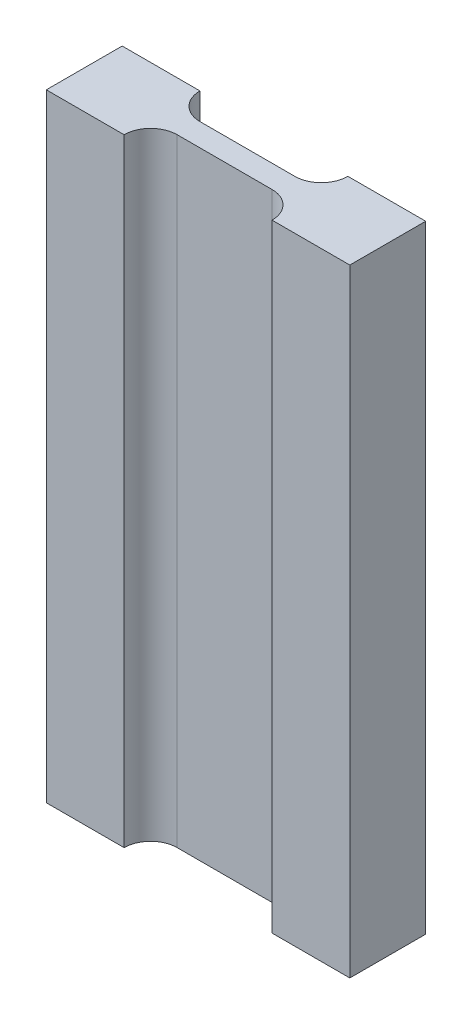
ISO-10303-21;
HEADER;
FILE_DESCRIPTION(('STEP AP214'),'2;1');
FILE_NAME('part.step','',(''),(''),'','','');
FILE_SCHEMA(('AUTOMOTIVE_DESIGN { 1 0 10303 214 1 1 1 1 }'));
ENDSEC;
DATA;
#1=APPLICATION_CONTEXT('core data for automotive mechanical design processes');
#2=APPLICATION_PROTOCOL_DEFINITION('international standard','automotive_design',2000,#1);
#3=PRODUCT_CONTEXT('',#1,'mechanical');
#4=PRODUCT('Part','Part','',(#3));
#5=PRODUCT_RELATED_PRODUCT_CATEGORY('part','',(#4));
#6=PRODUCT_DEFINITION_FORMATION('','',#4);
#7=PRODUCT_DEFINITION_CONTEXT('part definition',#1,'design');
#8=PRODUCT_DEFINITION('design','',#6,#7);
#9=PRODUCT_DEFINITION_SHAPE('','',#8);
#10=(LENGTH_UNIT() NAMED_UNIT(*) SI_UNIT(.MILLI.,.METRE.));
#11=(NAMED_UNIT(*) PLANE_ANGLE_UNIT() SI_UNIT($,.RADIAN.));
#12=(NAMED_UNIT(*) SI_UNIT($,.STERADIAN.) SOLID_ANGLE_UNIT());
#13=UNCERTAINTY_MEASURE_WITH_UNIT(LENGTH_MEASURE(1.E-05),#10,'distance_accuracy_value','');
#14=(GEOMETRIC_REPRESENTATION_CONTEXT(3) GLOBAL_UNCERTAINTY_ASSIGNED_CONTEXT((#13)) GLOBAL_UNIT_ASSIGNED_CONTEXT((#10,
#11,#12)) REPRESENTATION_CONTEXT('',''));
#15=CARTESIAN_POINT('',(0.,0.,0.));
#16=DIRECTION('',(0.,0.,1.));
#17=DIRECTION('',(1.,0.,0.));
#18=AXIS2_PLACEMENT_3D('',#15,#16,#17);
#19=CARTESIAN_POINT('',(0.,32.55,0.));
#20=DIRECTION('',(1.,0.,0.));
#21=DIRECTION('',(0.,0.,-1.));
#22=AXIS2_PLACEMENT_3D('',#19,#20,#21);
#23=PLANE('',#22);
#24=DIRECTION('',(0.,0.,1.));
#25=VECTOR('',#24,1.);
#26=CARTESIAN_POINT('',(0.,0.,0.));
#27=LINE('',#26,#25);
#28=CARTESIAN_POINT('',(0.,0.,-4.));
#29=VERTEX_POINT('',#28);
#30=CARTESIAN_POINT('',(0.,0.,0.));
#31=VERTEX_POINT('',#30);
#32=EDGE_CURVE('E169',#29,#31,#27,.T.);
#33=ORIENTED_EDGE('',*,*,#32,.T.);
#34=DIRECTION('',(0.,-1.,0.));
#35=VECTOR('',#34,1.);
#36=CARTESIAN_POINT('',(0.,32.55,0.));
#37=LINE('',#36,#35);
#38=CARTESIAN_POINT('',(0.,32.55,0.));
#39=VERTEX_POINT('',#38);
#40=EDGE_CURVE('E11',#39,#31,#37,.T.);
#41=ORIENTED_EDGE('',*,*,#40,.F.);
#42=DIRECTION('',(0.,0.,1.));
#43=VECTOR('',#42,1.);
#44=CARTESIAN_POINT('',(0.,32.55,0.));
#45=LINE('',#44,#43);
#46=CARTESIAN_POINT('',(0.,32.55,-4.));
#47=VERTEX_POINT('',#46);
#48=EDGE_CURVE('E204',#47,#39,#45,.T.);
#49=ORIENTED_EDGE('',*,*,#48,.F.);
#50=DIRECTION('',(0.,-1.,0.));
#51=VECTOR('',#50,1.);
#52=CARTESIAN_POINT('',(0.,32.55,-4.));
#53=LINE('',#52,#51);
#54=EDGE_CURVE('E168',#47,#29,#53,.T.);
#55=ORIENTED_EDGE('',*,*,#54,.T.);
#56=EDGE_LOOP('',(#33,#41,#49,#55));
#57=FACE_BOUND('',#56,.T.);
#58=ADVANCED_FACE('F44',(#57),#23,.F.);
#59=CARTESIAN_POINT('',(0.,32.55,0.));
#60=DIRECTION('',(0.,0.,-1.));
#61=DIRECTION('',(-1.,0.,0.));
#62=AXIS2_PLACEMENT_3D('',#59,#60,#61);
#63=PLANE('',#62);
#64=DIRECTION('',(1.,0.,0.));
#65=VECTOR('',#64,1.);
#66=CARTESIAN_POINT('',(0.,0.,0.));
#67=LINE('',#66,#65);
#68=CARTESIAN_POINT('',(4.1,0.,0.));
#69=VERTEX_POINT('',#68);
#70=EDGE_CURVE('E174',#31,#69,#67,.T.);
#71=ORIENTED_EDGE('',*,*,#70,.T.);
#72=DIRECTION('',(0.,-1.,0.));
#73=VECTOR('',#72,1.);
#74=CARTESIAN_POINT('',(4.1,32.55,0.));
#75=LINE('',#74,#73);
#76=CARTESIAN_POINT('',(4.1,32.55,0.));
#77=VERTEX_POINT('',#76);
#78=EDGE_CURVE('E53',#77,#69,#75,.T.);
#79=ORIENTED_EDGE('',*,*,#78,.F.);
#80=DIRECTION('',(1.,0.,0.));
#81=VECTOR('',#80,1.);
#82=CARTESIAN_POINT('',(0.,32.55,0.));
#83=LINE('',#82,#81);
#84=EDGE_CURVE('E117',#39,#77,#83,.T.);
#85=ORIENTED_EDGE('',*,*,#84,.F.);
#86=ORIENTED_EDGE('',*,*,#40,.T.);
#87=EDGE_LOOP('',(#71,#79,#85,#86));
#88=FACE_BOUND('',#87,.T.);
#89=ADVANCED_FACE('F299',(#88),#63,.F.);
#90=CARTESIAN_POINT('',(5.5,32.55,0.));
#91=DIRECTION('',(0.,-1.,0.));
#92=DIRECTION('',(0.,0.,-1.));
#93=AXIS2_PLACEMENT_3D('',#90,#91,#92);
#94=CYLINDRICAL_SURFACE('',#93,1.4);
#95=CARTESIAN_POINT('',(5.5,0.,0.));
#96=DIRECTION('',(0.,-1.,0.));
#97=DIRECTION('',(0.,0.,1.));
#98=AXIS2_PLACEMENT_3D('',#95,#96,#97);
#99=CIRCLE('',#98,1.4);
#100=CARTESIAN_POINT('',(5.5,0.,-1.4));
#101=VERTEX_POINT('',#100);
#102=EDGE_CURVE('E180',#69,#101,#99,.T.);
#103=ORIENTED_EDGE('',*,*,#102,.T.);
#104=DIRECTION('',(0.,-1.,0.));
#105=VECTOR('',#104,1.);
#106=CARTESIAN_POINT('',(5.5,32.55,-1.4));
#107=LINE('',#106,#105);
#108=CARTESIAN_POINT('',(5.5,32.55,-1.4));
#109=VERTEX_POINT('',#108);
#110=EDGE_CURVE('E231',#109,#101,#107,.T.);
#111=ORIENTED_EDGE('',*,*,#110,.F.);
#112=CARTESIAN_POINT('',(5.5,32.55,0.));
#113=DIRECTION('',(0.,-1.,0.));
#114=DIRECTION('',(0.,0.,1.));
#115=AXIS2_PLACEMENT_3D('',#112,#113,#114);
#116=CIRCLE('',#115,1.4);
#117=EDGE_CURVE('E241',#77,#109,#116,.T.);
#118=ORIENTED_EDGE('',*,*,#117,.F.);
#119=ORIENTED_EDGE('',*,*,#78,.T.);
#120=EDGE_LOOP('',(#103,#111,#118,#119));
#121=FACE_BOUND('',#120,.T.);
#122=ADVANCED_FACE('F236',(#121),#94,.F.);
#123=CARTESIAN_POINT('',(5.5,32.55,-1.4));
#124=DIRECTION('',(0.,0.,-1.));
#125=DIRECTION('',(-1.,0.,0.));
#126=AXIS2_PLACEMENT_3D('',#123,#124,#125);
#127=PLANE('',#126);
#128=DIRECTION('',(1.,0.,0.));
#129=VECTOR('',#128,1.);
#130=CARTESIAN_POINT('',(5.5,0.,-1.4));
#131=LINE('',#130,#129);
#132=CARTESIAN_POINT('',(10.5,0.,-1.4));
#133=VERTEX_POINT('',#132);
#134=EDGE_CURVE('E179',#101,#133,#131,.T.);
#135=ORIENTED_EDGE('',*,*,#134,.T.);
#136=DIRECTION('',(0.,-1.,0.));
#137=VECTOR('',#136,1.);
#138=CARTESIAN_POINT('',(10.5,32.55,-1.4));
#139=LINE('',#138,#137);
#140=CARTESIAN_POINT('',(10.5,32.55,-1.4));
#141=VERTEX_POINT('',#140);
#142=EDGE_CURVE('E230',#141,#133,#139,.T.);
#143=ORIENTED_EDGE('',*,*,#142,.F.);
#144=DIRECTION('',(1.,0.,0.));
#145=VECTOR('',#144,1.);
#146=CARTESIAN_POINT('',(5.5,32.55,-1.4));
#147=LINE('',#146,#145);
#148=EDGE_CURVE('E259',#109,#141,#147,.T.);
#149=ORIENTED_EDGE('',*,*,#148,.F.);
#150=ORIENTED_EDGE('',*,*,#110,.T.);
#151=EDGE_LOOP('',(#135,#143,#149,#150));
#152=FACE_BOUND('',#151,.T.);
#153=ADVANCED_FACE('F248',(#152),#127,.F.);
#154=CARTESIAN_POINT('',(10.5,32.55,0.));
#155=DIRECTION('',(0.,-1.,0.));
#156=DIRECTION('',(0.,0.,-1.));
#157=AXIS2_PLACEMENT_3D('',#154,#155,#156);
#158=CYLINDRICAL_SURFACE('',#157,1.4);
#159=CARTESIAN_POINT('',(10.5,0.,0.));
#160=DIRECTION('',(0.,-1.,0.));
#161=DIRECTION('',(0.,0.,-1.));
#162=AXIS2_PLACEMENT_3D('',#159,#160,#161);
#163=CIRCLE('',#162,1.4);
#164=CARTESIAN_POINT('',(11.9,0.,0.));
#165=VERTEX_POINT('',#164);
#166=EDGE_CURVE('E183',#133,#165,#163,.T.);
#167=ORIENTED_EDGE('',*,*,#166,.T.);
#168=DIRECTION('',(0.,-1.,0.));
#169=VECTOR('',#168,1.);
#170=CARTESIAN_POINT('',(11.9,32.55,0.));
#171=LINE('',#170,#169);
#172=CARTESIAN_POINT('',(11.9,32.55,0.));
#173=VERTEX_POINT('',#172);
#174=EDGE_CURVE('E223',#173,#165,#171,.T.);
#175=ORIENTED_EDGE('',*,*,#174,.F.);
#176=CARTESIAN_POINT('',(10.5,32.55,0.));
#177=DIRECTION('',(0.,-1.,0.));
#178=DIRECTION('',(0.,0.,-1.));
#179=AXIS2_PLACEMENT_3D('',#176,#177,#178);
#180=CIRCLE('',#179,1.4);
#181=EDGE_CURVE('E258',#141,#173,#180,.T.);
#182=ORIENTED_EDGE('',*,*,#181,.F.);
#183=ORIENTED_EDGE('',*,*,#142,.T.);
#184=EDGE_LOOP('',(#167,#175,#182,#183));
#185=FACE_BOUND('',#184,.T.);
#186=ADVANCED_FACE('F253',(#185),#158,.F.);
#187=CARTESIAN_POINT('',(11.9,32.55,0.));
#188=DIRECTION('',(0.,0.,-1.));
#189=DIRECTION('',(-1.,0.,0.));
#190=AXIS2_PLACEMENT_3D('',#187,#188,#189);
#191=PLANE('',#190);
#192=DIRECTION('',(1.,0.,0.));
#193=VECTOR('',#192,1.);
#194=CARTESIAN_POINT('',(11.9,0.,0.));
#195=LINE('',#194,#193);
#196=CARTESIAN_POINT('',(16.,0.,0.));
#197=VERTEX_POINT('',#196);
#198=EDGE_CURVE('E186',#165,#197,#195,.T.);
#199=ORIENTED_EDGE('',*,*,#198,.T.);
#200=DIRECTION('',(0.,-1.,0.));
#201=VECTOR('',#200,1.);
#202=CARTESIAN_POINT('',(16.,32.55,0.));
#203=LINE('',#202,#201);
#204=CARTESIAN_POINT('',(16.,32.55,0.));
#205=VERTEX_POINT('',#204);
#206=EDGE_CURVE('E219',#205,#197,#203,.T.);
#207=ORIENTED_EDGE('',*,*,#206,.F.);
#208=DIRECTION('',(1.,0.,0.));
#209=VECTOR('',#208,1.);
#210=CARTESIAN_POINT('',(11.9,32.55,0.));
#211=LINE('',#210,#209);
#212=EDGE_CURVE('E260',#173,#205,#211,.T.);
#213=ORIENTED_EDGE('',*,*,#212,.F.);
#214=ORIENTED_EDGE('',*,*,#174,.T.);
#215=EDGE_LOOP('',(#199,#207,#213,#214));
#216=FACE_BOUND('',#215,.T.);
#217=ADVANCED_FACE('F311',(#216),#191,.F.);
#218=CARTESIAN_POINT('',(16.,32.55,0.));
#219=DIRECTION('',(-1.,0.,0.));
#220=DIRECTION('',(0.,0.,1.));
#221=AXIS2_PLACEMENT_3D('',#218,#219,#220);
#222=PLANE('',#221);
#223=DIRECTION('',(0.,0.,-1.));
#224=VECTOR('',#223,1.);
#225=CARTESIAN_POINT('',(16.,0.,0.));
#226=LINE('',#225,#224);
#227=CARTESIAN_POINT('',(16.,0.,-4.));
#228=VERTEX_POINT('',#227);
#229=EDGE_CURVE('E188',#197,#228,#226,.T.);
#230=ORIENTED_EDGE('',*,*,#229,.T.);
#231=DIRECTION('',(0.,-1.,0.));
#232=VECTOR('',#231,1.);
#233=CARTESIAN_POINT('',(16.,32.55,-4.));
#234=LINE('',#233,#232);
#235=CARTESIAN_POINT('',(16.,32.55,-4.));
#236=VERTEX_POINT('',#235);
#237=EDGE_CURVE('E214',#236,#228,#234,.T.);
#238=ORIENTED_EDGE('',*,*,#237,.F.);
#239=DIRECTION('',(0.,0.,-1.));
#240=VECTOR('',#239,1.);
#241=CARTESIAN_POINT('',(16.,32.55,0.));
#242=LINE('',#241,#240);
#243=EDGE_CURVE('E264',#205,#236,#242,.T.);
#244=ORIENTED_EDGE('',*,*,#243,.F.);
#245=ORIENTED_EDGE('',*,*,#206,.T.);
#246=EDGE_LOOP('',(#230,#238,#244,#245));
#247=FACE_BOUND('',#246,.T.);
#248=ADVANCED_FACE('F312',(#247),#222,.F.);
#249=CARTESIAN_POINT('',(11.9,32.55,-4.));
#250=DIRECTION('',(0.,0.,1.));
#251=DIRECTION('',(1.,0.,0.));
#252=AXIS2_PLACEMENT_3D('',#249,#250,#251);
#253=PLANE('',#252);
#254=DIRECTION('',(-1.,0.,0.));
#255=VECTOR('',#254,1.);
#256=CARTESIAN_POINT('',(11.9,0.,-4.));
#257=LINE('',#256,#255);
#258=CARTESIAN_POINT('',(11.9,0.,-4.));
#259=VERTEX_POINT('',#258);
#260=EDGE_CURVE('E195',#228,#259,#257,.T.);
#261=ORIENTED_EDGE('',*,*,#260,.T.);
#262=DIRECTION('',(0.,-1.,0.));
#263=VECTOR('',#262,1.);
#264=CARTESIAN_POINT('',(11.9,32.55,-4.));
#265=LINE('',#264,#263);
#266=CARTESIAN_POINT('',(11.9,32.55,-4.));
#267=VERTEX_POINT('',#266);
#268=EDGE_CURVE('E213',#267,#259,#265,.T.);
#269=ORIENTED_EDGE('',*,*,#268,.F.);
#270=DIRECTION('',(-1.,0.,0.));
#271=VECTOR('',#270,1.);
#272=CARTESIAN_POINT('',(11.9,32.55,-4.));
#273=LINE('',#272,#271);
#274=EDGE_CURVE('E271',#236,#267,#273,.T.);
#275=ORIENTED_EDGE('',*,*,#274,.F.);
#276=ORIENTED_EDGE('',*,*,#237,.T.);
#277=EDGE_LOOP('',(#261,#269,#275,#276));
#278=FACE_BOUND('',#277,.T.);
#279=ADVANCED_FACE('F278',(#278),#253,.F.);
#280=CARTESIAN_POINT('',(10.5,32.55,-4.));
#281=DIRECTION('',(0.,-1.,0.));
#282=DIRECTION('',(0.,0.,-1.));
#283=AXIS2_PLACEMENT_3D('',#280,#281,#282);
#284=CYLINDRICAL_SURFACE('',#283,1.4);
#285=CARTESIAN_POINT('',(10.5,0.,-4.));
#286=DIRECTION('',(0.,-1.,0.));
#287=DIRECTION('',(0.,0.,1.));
#288=AXIS2_PLACEMENT_3D('',#285,#286,#287);
#289=CIRCLE('',#288,1.4);
#290=CARTESIAN_POINT('',(10.5,0.,-2.6));
#291=VERTEX_POINT('',#290);
#292=EDGE_CURVE('E193',#259,#291,#289,.T.);
#293=ORIENTED_EDGE('',*,*,#292,.T.);
#294=DIRECTION('',(0.,-1.,0.));
#295=VECTOR('',#294,1.);
#296=CARTESIAN_POINT('',(10.5,32.55,-2.6));
#297=LINE('',#296,#295);
#298=CARTESIAN_POINT('',(10.5,32.55,-2.6));
#299=VERTEX_POINT('',#298);
#300=EDGE_CURVE('E159',#299,#291,#297,.T.);
#301=ORIENTED_EDGE('',*,*,#300,.F.);
#302=CARTESIAN_POINT('',(10.5,32.55,-4.));
#303=DIRECTION('',(0.,-1.,0.));
#304=DIRECTION('',(0.,0.,1.));
#305=AXIS2_PLACEMENT_3D('',#302,#303,#304);
#306=CIRCLE('',#305,1.4);
#307=EDGE_CURVE('E149',#267,#299,#306,.T.);
#308=ORIENTED_EDGE('',*,*,#307,.F.);
#309=ORIENTED_EDGE('',*,*,#268,.T.);
#310=EDGE_LOOP('',(#293,#301,#308,#309));
#311=FACE_BOUND('',#310,.T.);
#312=ADVANCED_FACE('F284',(#311),#284,.F.);
#313=CARTESIAN_POINT('',(5.5,32.55,-2.6));
#314=DIRECTION('',(0.,0.,1.));
#315=DIRECTION('',(1.,0.,0.));
#316=AXIS2_PLACEMENT_3D('',#313,#314,#315);
#317=PLANE('',#316);
#318=DIRECTION('',(-1.,0.,0.));
#319=VECTOR('',#318,1.);
#320=CARTESIAN_POINT('',(5.5,0.,-2.6));
#321=LINE('',#320,#319);
#322=CARTESIAN_POINT('',(5.5,0.,-2.6));
#323=VERTEX_POINT('',#322);
#324=EDGE_CURVE('E160',#291,#323,#321,.T.);
#325=ORIENTED_EDGE('',*,*,#324,.T.);
#326=DIRECTION('',(0.,-1.,0.));
#327=VECTOR('',#326,1.);
#328=CARTESIAN_POINT('',(5.5,32.55,-2.6));
#329=LINE('',#328,#327);
#330=CARTESIAN_POINT('',(5.5,32.55,-2.6));
#331=VERTEX_POINT('',#330);
#332=EDGE_CURVE('E153',#331,#323,#329,.T.);
#333=ORIENTED_EDGE('',*,*,#332,.F.);
#334=DIRECTION('',(-1.,0.,0.));
#335=VECTOR('',#334,1.);
#336=CARTESIAN_POINT('',(5.5,32.55,-2.6));
#337=LINE('',#336,#335);
#338=EDGE_CURVE('E145',#299,#331,#337,.T.);
#339=ORIENTED_EDGE('',*,*,#338,.F.);
#340=ORIENTED_EDGE('',*,*,#300,.T.);
#341=EDGE_LOOP('',(#325,#333,#339,#340));
#342=FACE_BOUND('',#341,.T.);
#343=ADVANCED_FACE('F155',(#342),#317,.F.);
#344=CARTESIAN_POINT('',(5.5,32.55,-4.));
#345=DIRECTION('',(0.,-1.,0.));
#346=DIRECTION('',(0.,0.,-1.));
#347=AXIS2_PLACEMENT_3D('',#344,#345,#346);
#348=CYLINDRICAL_SURFACE('',#347,1.4);
#349=CARTESIAN_POINT('',(5.5,0.,-4.));
#350=DIRECTION('',(0.,-1.,0.));
#351=DIRECTION('',(0.,0.,-1.));
#352=AXIS2_PLACEMENT_3D('',#349,#350,#351);
#353=CIRCLE('',#352,1.4);
#354=CARTESIAN_POINT('',(4.1,0.,-4.));
#355=VERTEX_POINT('',#354);
#356=EDGE_CURVE('E104',#323,#355,#353,.T.);
#357=ORIENTED_EDGE('',*,*,#356,.T.);
#358=DIRECTION('',(0.,-1.,0.));
#359=VECTOR('',#358,1.);
#360=CARTESIAN_POINT('',(4.1,32.55,-4.));
#361=LINE('',#360,#359);
#362=CARTESIAN_POINT('',(4.1,32.55,-4.));
#363=VERTEX_POINT('',#362);
#364=EDGE_CURVE('E158',#363,#355,#361,.T.);
#365=ORIENTED_EDGE('',*,*,#364,.F.);
#366=CARTESIAN_POINT('',(5.5,32.55,-4.));
#367=DIRECTION('',(0.,-1.,0.));
#368=DIRECTION('',(0.,0.,-1.));
#369=AXIS2_PLACEMENT_3D('',#366,#367,#368);
#370=CIRCLE('',#369,1.4);
#371=EDGE_CURVE('E147',#331,#363,#370,.T.);
#372=ORIENTED_EDGE('',*,*,#371,.F.);
#373=ORIENTED_EDGE('',*,*,#332,.T.);
#374=EDGE_LOOP('',(#357,#365,#372,#373));
#375=FACE_BOUND('',#374,.T.);
#376=ADVANCED_FACE('F162',(#375),#348,.F.);
#377=CARTESIAN_POINT('',(0.,32.55,-4.));
#378=DIRECTION('',(0.,0.,1.));
#379=DIRECTION('',(1.,0.,0.));
#380=AXIS2_PLACEMENT_3D('',#377,#378,#379);
#381=PLANE('',#380);
#382=DIRECTION('',(-1.,0.,0.));
#383=VECTOR('',#382,1.);
#384=CARTESIAN_POINT('',(0.,0.,-4.));
#385=LINE('',#384,#383);
#386=EDGE_CURVE('E108',#355,#29,#385,.T.);
#387=ORIENTED_EDGE('',*,*,#386,.T.);
#388=ORIENTED_EDGE('',*,*,#54,.F.);
#389=DIRECTION('',(-1.,0.,0.));
#390=VECTOR('',#389,1.);
#391=CARTESIAN_POINT('',(0.,32.55,-4.));
#392=LINE('',#391,#390);
#393=EDGE_CURVE('E62',#363,#47,#392,.T.);
#394=ORIENTED_EDGE('',*,*,#393,.F.);
#395=ORIENTED_EDGE('',*,*,#364,.T.);
#396=EDGE_LOOP('',(#387,#388,#394,#395));
#397=FACE_BOUND('',#396,.T.);
#398=ADVANCED_FACE('F287',(#397),#381,.F.);
#399=CARTESIAN_POINT('',(5.5,32.55,-4.));
#400=DIRECTION('',(0.,-1.,0.));
#401=DIRECTION('',(0.,0.,-1.));
#402=AXIS2_PLACEMENT_3D('',#399,#400,#401);
#403=PLANE('',#402);
#404=ORIENTED_EDGE('',*,*,#48,.T.);
#405=ORIENTED_EDGE('',*,*,#84,.T.);
#406=ORIENTED_EDGE('',*,*,#117,.T.);
#407=ORIENTED_EDGE('',*,*,#148,.T.);
#408=ORIENTED_EDGE('',*,*,#181,.T.);
#409=ORIENTED_EDGE('',*,*,#212,.T.);
#410=ORIENTED_EDGE('',*,*,#243,.T.);
#411=ORIENTED_EDGE('',*,*,#274,.T.);
#412=ORIENTED_EDGE('',*,*,#307,.T.);
#413=ORIENTED_EDGE('',*,*,#338,.T.);
#414=ORIENTED_EDGE('',*,*,#371,.T.);
#415=ORIENTED_EDGE('',*,*,#393,.T.);
#416=EDGE_LOOP('',(#404,#405,#406,#407,#408,#409,#410,#411,#412,#413,#414,#415));
#417=FACE_BOUND('',#416,.T.);
#418=ADVANCED_FACE('F143',(#417),#403,.F.);
#419=CARTESIAN_POINT('',(5.5,0.,-4.));
#420=DIRECTION('',(0.,-1.,0.));
#421=DIRECTION('',(0.,0.,-1.));
#422=AXIS2_PLACEMENT_3D('',#419,#420,#421);
#423=PLANE('',#422);
#424=ORIENTED_EDGE('',*,*,#32,.F.);
#425=ORIENTED_EDGE('',*,*,#386,.F.);
#426=ORIENTED_EDGE('',*,*,#356,.F.);
#427=ORIENTED_EDGE('',*,*,#324,.F.);
#428=ORIENTED_EDGE('',*,*,#292,.F.);
#429=ORIENTED_EDGE('',*,*,#260,.F.);
#430=ORIENTED_EDGE('',*,*,#229,.F.);
#431=ORIENTED_EDGE('',*,*,#198,.F.);
#432=ORIENTED_EDGE('',*,*,#166,.F.);
#433=ORIENTED_EDGE('',*,*,#134,.F.);
#434=ORIENTED_EDGE('',*,*,#102,.F.);
#435=ORIENTED_EDGE('',*,*,#70,.F.);
#436=EDGE_LOOP('',(#424,#425,#426,#427,#428,#429,#430,#431,#432,#433,#434,#435));
#437=FACE_BOUND('',#436,.T.);
#438=ADVANCED_FACE('F245',(#437),#423,.T.);
#439=CLOSED_SHELL('',(#58,#89,#122,#153,#186,#217,#248,#279,#312,#343,#376,#398,#418,#438));
#440=MANIFOLD_SOLID_BREP('B2',#439);
#441=ADVANCED_BREP_SHAPE_REPRESENTATION('',(#18,#440),#14);
#442=SHAPE_DEFINITION_REPRESENTATION(#9,#441);
ENDSEC;
END-ISO-10303-21;
